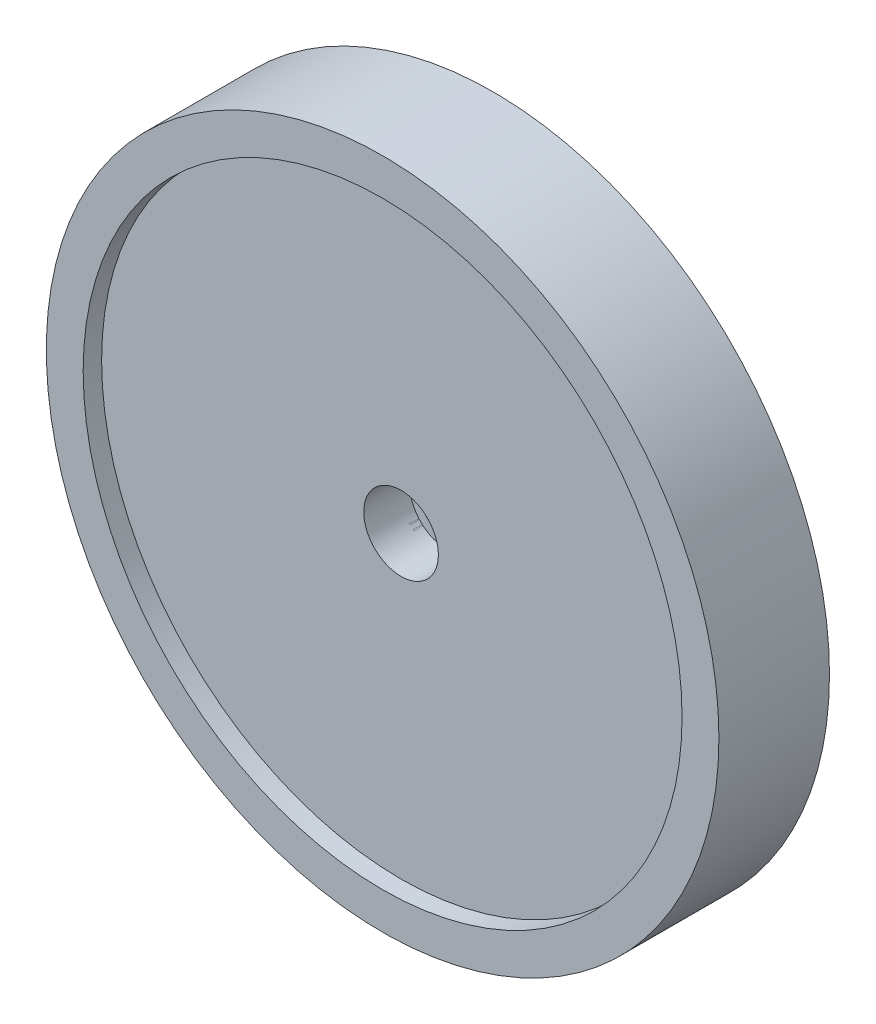
ISO-10303-21;
HEADER;
FILE_DESCRIPTION(('STEP AP214'),'2;1');
FILE_NAME('part.step','',(''),(''),'','','');
FILE_SCHEMA(('AUTOMOTIVE_DESIGN { 1 0 10303 214 1 1 1 1 }'));
ENDSEC;
DATA;
#1=APPLICATION_CONTEXT('core data for automotive mechanical design processes');
#2=APPLICATION_PROTOCOL_DEFINITION('international standard','automotive_design',2000,#1);
#3=PRODUCT_CONTEXT('',#1,'mechanical');
#4=PRODUCT('Part','Part','',(#3));
#5=PRODUCT_RELATED_PRODUCT_CATEGORY('part','',(#4));
#6=PRODUCT_DEFINITION_FORMATION('','',#4);
#7=PRODUCT_DEFINITION_CONTEXT('part definition',#1,'design');
#8=PRODUCT_DEFINITION('design','',#6,#7);
#9=PRODUCT_DEFINITION_SHAPE('','',#8);
#10=(LENGTH_UNIT() NAMED_UNIT(*) SI_UNIT(.MILLI.,.METRE.));
#11=(NAMED_UNIT(*) PLANE_ANGLE_UNIT() SI_UNIT($,.RADIAN.));
#12=(NAMED_UNIT(*) SI_UNIT($,.STERADIAN.) SOLID_ANGLE_UNIT());
#13=UNCERTAINTY_MEASURE_WITH_UNIT(LENGTH_MEASURE(1.E-05),#10,'distance_accuracy_value','');
#14=(GEOMETRIC_REPRESENTATION_CONTEXT(3) GLOBAL_UNCERTAINTY_ASSIGNED_CONTEXT((#13)) GLOBAL_UNIT_ASSIGNED_CONTEXT((#10,
#11,#12)) REPRESENTATION_CONTEXT('',''));
#15=CARTESIAN_POINT('',(0.,0.,0.));
#16=DIRECTION('',(0.,0.,1.));
#17=DIRECTION('',(1.,0.,0.));
#18=AXIS2_PLACEMENT_3D('',#15,#16,#17);
#19=CARTESIAN_POINT('',(0.,0.,-9.34562073675797));
#20=DIRECTION('',(0.,0.,-1.));
#21=DIRECTION('',(-1.,0.,0.));
#22=AXIS2_PLACEMENT_3D('',#19,#20,#21);
#23=PLANE('',#22);
#24=CARTESIAN_POINT('',(0.,0.,-9.34562073675797));
#25=DIRECTION('',(0.,0.,-1.));
#26=DIRECTION('',(-1.,0.,0.));
#27=AXIS2_PLACEMENT_3D('',#24,#25,#26);
#28=CIRCLE('',#27,4.05);
#29=CARTESIAN_POINT('',(-4.05,0.,-9.34562073675797));
#30=VERTEX_POINT('',#29);
#31=EDGE_CURVE('E11',#30,#30,#28,.T.);
#32=ORIENTED_EDGE('',*,*,#31,.T.);
#33=EDGE_LOOP('',(#32));
#34=FACE_BOUND('',#33,.T.);
#35=CARTESIAN_POINT('',(0.,0.,-9.34562073675797));
#36=DIRECTION('',(0.,0.,-1.));
#37=DIRECTION('',(-1.,0.,0.));
#38=AXIS2_PLACEMENT_3D('',#35,#36,#37);
#39=CIRCLE('',#38,3.05);
#40=CARTESIAN_POINT('',(-3.05,0.,-9.34562073675797));
#41=VERTEX_POINT('',#40);
#42=EDGE_CURVE('E55',#41,#41,#39,.T.);
#43=ORIENTED_EDGE('',*,*,#42,.F.);
#44=EDGE_LOOP('',(#43));
#45=FACE_BOUND('',#44,.T.);
#46=ADVANCED_FACE('F44',(#34,#45),#23,.T.);
#47=CARTESIAN_POINT('',(0.,0.,-1.));
#48=DIRECTION('',(0.,0.,-1.));
#49=DIRECTION('',(-1.,0.,0.));
#50=AXIS2_PLACEMENT_3D('',#47,#48,#49);
#51=PLANE('',#50);
#52=CARTESIAN_POINT('',(0.,0.,-1.));
#53=DIRECTION('',(0.,0.,-1.));
#54=DIRECTION('',(-1.,0.,0.));
#55=AXIS2_PLACEMENT_3D('',#52,#53,#54);
#56=CIRCLE('',#55,4.05);
#57=CARTESIAN_POINT('',(-4.05,0.,-1.));
#58=VERTEX_POINT('',#57);
#59=EDGE_CURVE('E48',#58,#58,#56,.T.);
#60=ORIENTED_EDGE('',*,*,#59,.F.);
#61=EDGE_LOOP('',(#60));
#62=FACE_BOUND('',#61,.T.);
#63=CARTESIAN_POINT('',(0.,0.,-1.));
#64=DIRECTION('',(0.,0.,-1.));
#65=DIRECTION('',(-1.,0.,0.));
#66=AXIS2_PLACEMENT_3D('',#63,#64,#65);
#67=CIRCLE('',#66,3.05);
#68=CARTESIAN_POINT('',(-3.05,0.,-1.));
#69=VERTEX_POINT('',#68);
#70=EDGE_CURVE('E57',#69,#69,#67,.T.);
#71=ORIENTED_EDGE('',*,*,#70,.T.);
#72=EDGE_LOOP('',(#71));
#73=FACE_BOUND('',#72,.T.);
#74=ADVANCED_FACE('F67',(#62,#73),#51,.F.);
#75=CARTESIAN_POINT('',(0.,0.,-9.34562073675797));
#76=DIRECTION('',(0.,0.,1.));
#77=DIRECTION('',(1.,0.,0.));
#78=AXIS2_PLACEMENT_3D('',#75,#76,#77);
#79=CYLINDRICAL_SURFACE('',#78,4.05);
#80=ORIENTED_EDGE('',*,*,#31,.F.);
#81=EDGE_LOOP('',(#80));
#82=FACE_BOUND('',#81,.T.);
#83=ORIENTED_EDGE('',*,*,#59,.T.);
#84=EDGE_LOOP('',(#83));
#85=FACE_BOUND('',#84,.T.);
#86=ADVANCED_FACE('F46',(#82,#85),#79,.T.);
#87=CARTESIAN_POINT('',(0.,0.,-9.34562073675797));
#88=DIRECTION('',(0.,0.,1.));
#89=DIRECTION('',(1.,0.,0.));
#90=AXIS2_PLACEMENT_3D('',#87,#88,#89);
#91=CYLINDRICAL_SURFACE('',#90,3.05);
#92=ORIENTED_EDGE('',*,*,#42,.T.);
#93=EDGE_LOOP('',(#92));
#94=FACE_BOUND('',#93,.T.);
#95=ORIENTED_EDGE('',*,*,#70,.F.);
#96=EDGE_LOOP('',(#95));
#97=FACE_BOUND('',#96,.T.);
#98=ADVANCED_FACE('F63',(#94,#97),#91,.F.);
#99=CLOSED_SHELL('',(#46,#74,#86,#98));
#100=MANIFOLD_SOLID_BREP('B2',#99);
#101=CARTESIAN_POINT('',(-11.329341995104,10.6222352139174,0.));
#102=DIRECTION('',(0.,0.,-1.));
#103=DIRECTION('',(-1.,0.,0.));
#104=AXIS2_PLACEMENT_3D('',#101,#102,#103);
#105=PLANE('',#104);
#106=CARTESIAN_POINT('',(0.,0.,0.));
#107=DIRECTION('',(0.,0.,-1.));
#108=DIRECTION('',(-1.,0.,0.));
#109=AXIS2_PLACEMENT_3D('',#106,#107,#108);
#110=CIRCLE('',#109,4.05);
#111=CARTESIAN_POINT('',(2.48832099086697,-3.19542777205351,0.));
#112=VERTEX_POINT('',#111);
#113=CARTESIAN_POINT('',(3.19542777205351,-2.48832099086696,0.));
#114=VERTEX_POINT('',#113);
#115=EDGE_CURVE('E120',#112,#114,#110,.F.);
#116=ORIENTED_EDGE('',*,*,#115,.F.);
#117=DIRECTION('',(-0.707106781186549,0.707106781186546,0.));
#118=VECTOR('',#117,1.);
#119=CARTESIAN_POINT('',(-11.329341995104,10.6222352139174,0.));
#120=LINE('',#119,#118);
#121=CARTESIAN_POINT('',(10.6222352139174,-11.3293419951039,0.));
#122=VERTEX_POINT('',#121);
#123=EDGE_CURVE('E157',#122,#112,#120,.T.);
#124=ORIENTED_EDGE('',*,*,#123,.F.);
#125=DIRECTION('',(0.707106781186546,0.707106781186549,0.));
#126=VECTOR('',#125,1.);
#127=CARTESIAN_POINT('',(10.6222352139174,-11.3293419951039,0.));
#128=LINE('',#127,#126);
#129=CARTESIAN_POINT('',(11.329341995104,-10.6222352139174,0.));
#130=VERTEX_POINT('',#129);
#131=EDGE_CURVE('E161',#122,#130,#128,.T.);
#132=ORIENTED_EDGE('',*,*,#131,.T.);
#133=DIRECTION('',(-0.707106781186549,0.707106781186546,0.));
#134=VECTOR('',#133,1.);
#135=CARTESIAN_POINT('',(-10.6222352139174,11.3293419951039,0.));
#136=LINE('',#135,#134);
#137=EDGE_CURVE('E155',#130,#114,#136,.T.);
#138=ORIENTED_EDGE('',*,*,#137,.T.);
#139=EDGE_LOOP('',(#116,#124,#132,#138));
#140=FACE_BOUND('',#139,.T.);
#141=ADVANCED_FACE('F116',(#140),#105,.F.);
#142=CARTESIAN_POINT('',(-0.353553390593273,-0.353553390593274,0.));
#143=DIRECTION('',(0.707106781186546,0.707106781186549,0.));
#144=DIRECTION('',(-0.707106781186549,0.707106781186546,0.));
#145=AXIS2_PLACEMENT_3D('',#142,#143,#144);
#146=PLANE('',#145);
#147=DIRECTION('',(0.,0.,1.));
#148=VECTOR('',#147,1.);
#149=CARTESIAN_POINT('',(2.48832099086697,-3.19542777205351,-74.));
#150=LINE('',#149,#148);
#151=CARTESIAN_POINT('',(2.48832099086697,-3.19542777205351,-9.34652087360312));
#152=VERTEX_POINT('',#151);
#153=EDGE_CURVE('E146',#152,#112,#150,.T.);
#154=ORIENTED_EDGE('',*,*,#153,.F.);
#155=DIRECTION('',(0.548789430225534,-0.548789430225533,0.630603141877258));
#156=VECTOR('',#155,1.);
#157=CARTESIAN_POINT('',(10.6222352139174,-11.3293419951039,0.));
#158=LINE('',#157,#156);
#159=EDGE_CURVE('E162',#152,#122,#158,.T.);
#160=ORIENTED_EDGE('',*,*,#159,.T.);
#161=ORIENTED_EDGE('',*,*,#123,.T.);
#162=EDGE_LOOP('',(#154,#160,#161));
#163=FACE_BOUND('',#162,.T.);
#164=ADVANCED_FACE('F172',(#163),#146,.F.);
#165=CARTESIAN_POINT('',(0.353553390593273,0.353553390593274,0.));
#166=DIRECTION('',(0.707106781186546,0.707106781186549,0.));
#167=DIRECTION('',(-0.707106781186549,0.707106781186546,0.));
#168=AXIS2_PLACEMENT_3D('',#165,#166,#167);
#169=PLANE('',#168);
#170=DIRECTION('',(0.548789430225534,-0.548789430225533,0.630603141877258));
#171=VECTOR('',#170,1.);
#172=CARTESIAN_POINT('',(11.329341995104,-10.6222352139174,0.));
#173=LINE('',#172,#171);
#174=CARTESIAN_POINT('',(3.19542777205351,-2.48832099086696,-9.34652087360313));
#175=VERTEX_POINT('',#174);
#176=EDGE_CURVE('E156',#175,#130,#173,.T.);
#177=ORIENTED_EDGE('',*,*,#176,.F.);
#178=DIRECTION('',(0.,0.,1.));
#179=VECTOR('',#178,1.);
#180=CARTESIAN_POINT('',(3.19542777205351,-2.48832099086696,-74.));
#181=LINE('',#180,#179);
#182=EDGE_CURVE('E145',#175,#114,#181,.T.);
#183=ORIENTED_EDGE('',*,*,#182,.T.);
#184=ORIENTED_EDGE('',*,*,#137,.F.);
#185=EDGE_LOOP('',(#177,#183,#184));
#186=FACE_BOUND('',#185,.T.);
#187=ADVANCED_FACE('F154',(#186),#169,.T.);
#188=CARTESIAN_POINT('',(10.6222352139174,-11.3293419951039,0.));
#189=DIRECTION('',(-0.445903757858952,0.445903757858951,0.776105455111953));
#190=DIRECTION('',(0.867078545472335,0.,0.498171452395238));
#191=AXIS2_PLACEMENT_3D('',#188,#189,#190);
#192=PLANE('',#191);
#193=CARTESIAN_POINT('',(0.,0.,-12.6120628375452));
#194=DIRECTION('',(-0.445903757858952,0.445903757858951,0.776105455111953));
#195=DIRECTION('',(0.548789430225534,-0.548789430225533,0.630603141877258));
#196=AXIS2_PLACEMENT_3D('',#193,#194,#195);
#197=ELLIPSE('',#196,5.2183630115263,4.05);
#198=EDGE_CURVE('E42',#175,#152,#197,.F.);
#199=ORIENTED_EDGE('',*,*,#198,.F.);
#200=ORIENTED_EDGE('',*,*,#176,.T.);
#201=ORIENTED_EDGE('',*,*,#131,.F.);
#202=ORIENTED_EDGE('',*,*,#159,.F.);
#203=EDGE_LOOP('',(#199,#200,#201,#202));
#204=FACE_BOUND('',#203,.T.);
#205=ADVANCED_FACE('F169',(#204),#192,.F.);
#206=CARTESIAN_POINT('',(0.,0.,-74.));
#207=DIRECTION('',(0.,0.,1.));
#208=DIRECTION('',(1.,0.,0.));
#209=AXIS2_PLACEMENT_3D('',#206,#207,#208);
#210=CYLINDRICAL_SURFACE('',#209,4.05);
#211=ORIENTED_EDGE('',*,*,#153,.T.);
#212=ORIENTED_EDGE('',*,*,#115,.T.);
#213=ORIENTED_EDGE('',*,*,#182,.F.);
#214=ORIENTED_EDGE('',*,*,#198,.T.);
#215=EDGE_LOOP('',(#211,#212,#213,#214));
#216=FACE_BOUND('',#215,.T.);
#217=ADVANCED_FACE('F118',(#216),#210,.F.);
#218=CLOSED_SHELL('',(#141,#164,#187,#205,#217));
#219=MANIFOLD_SOLID_BREP('B6',#218);
#220=CARTESIAN_POINT('',(10.526611910621,11.2337186918076,0.));
#221=DIRECTION('',(0.,0.,-1.));
#222=DIRECTION('',(-1.,0.,0.));
#223=AXIS2_PLACEMENT_3D('',#220,#221,#222);
#224=PLANE('',#223);
#225=CARTESIAN_POINT('',(0.,0.,0.));
#226=DIRECTION('',(0.,0.,-1.));
#227=DIRECTION('',(-1.,0.,0.));
#228=AXIS2_PLACEMENT_3D('',#225,#226,#227);
#229=CIRCLE('',#228,4.05);
#230=CARTESIAN_POINT('',(-3.19542777205351,-2.48832099086697,0.));
#231=VERTEX_POINT('',#230);
#232=CARTESIAN_POINT('',(-2.48832099086696,-3.19542777205351,0.));
#233=VERTEX_POINT('',#232);
#234=EDGE_CURVE('E228',#231,#233,#229,.F.);
#235=ORIENTED_EDGE('',*,*,#234,.F.);
#236=DIRECTION('',(0.707106781186546,0.707106781186549,0.));
#237=VECTOR('',#236,1.);
#238=CARTESIAN_POINT('',(10.526611910621,11.2337186918076,0.));
#239=LINE('',#238,#237);
#240=CARTESIAN_POINT('',(-11.4249652984003,-10.7178585172138,0.));
#241=VERTEX_POINT('',#240);
#242=EDGE_CURVE('E265',#241,#231,#239,.T.);
#243=ORIENTED_EDGE('',*,*,#242,.F.);
#244=DIRECTION('',(0.707106781186549,-0.707106781186546,0.));
#245=VECTOR('',#244,1.);
#246=CARTESIAN_POINT('',(-11.4249652984003,-10.7178585172138,0.));
#247=LINE('',#246,#245);
#248=CARTESIAN_POINT('',(-10.7178585172137,-11.4249652984003,0.));
#249=VERTEX_POINT('',#248);
#250=EDGE_CURVE('E269',#241,#249,#247,.T.);
#251=ORIENTED_EDGE('',*,*,#250,.T.);
#252=DIRECTION('',(0.707106781186546,0.707106781186549,0.));
#253=VECTOR('',#252,1.);
#254=CARTESIAN_POINT('',(11.2337186918076,10.5266119106211,0.));
#255=LINE('',#254,#253);
#256=EDGE_CURVE('E263',#249,#233,#255,.T.);
#257=ORIENTED_EDGE('',*,*,#256,.T.);
#258=EDGE_LOOP('',(#235,#243,#251,#257));
#259=FACE_BOUND('',#258,.T.);
#260=ADVANCED_FACE('F224',(#259),#224,.F.);
#261=CARTESIAN_POINT('',(-0.353553390593276,0.353553390593274,0.));
#262=DIRECTION('',(0.707106781186549,-0.707106781186546,0.));
#263=DIRECTION('',(0.707106781186546,0.707106781186549,0.));
#264=AXIS2_PLACEMENT_3D('',#261,#262,#263);
#265=PLANE('',#264);
#266=DIRECTION('',(0.,0.,1.));
#267=VECTOR('',#266,1.);
#268=CARTESIAN_POINT('',(-3.1954277720535,-2.48832099086698,-74.));
#269=LINE('',#268,#267);
#270=CARTESIAN_POINT('',(-3.19542777205351,-2.48832099086697,-9.45639973091015));
#271=VERTEX_POINT('',#270);
#272=EDGE_CURVE('E254',#271,#231,#269,.T.);
#273=ORIENTED_EDGE('',*,*,#272,.F.);
#274=DIRECTION('',(-0.548789430225533,-0.548789430225534,0.630603141877258));
#275=VECTOR('',#274,1.);
#276=CARTESIAN_POINT('',(-11.4249652984003,-10.7178585172138,0.));
#277=LINE('',#276,#275);
#278=EDGE_CURVE('E270',#271,#241,#277,.T.);
#279=ORIENTED_EDGE('',*,*,#278,.T.);
#280=ORIENTED_EDGE('',*,*,#242,.T.);
#281=EDGE_LOOP('',(#273,#279,#280));
#282=FACE_BOUND('',#281,.T.);
#283=ADVANCED_FACE('F280',(#282),#265,.F.);
#284=CARTESIAN_POINT('',(0.353553390593273,-0.353553390593272,0.));
#285=DIRECTION('',(0.707106781186549,-0.707106781186546,0.));
#286=DIRECTION('',(0.707106781186546,0.707106781186549,0.));
#287=AXIS2_PLACEMENT_3D('',#284,#285,#286);
#288=PLANE('',#287);
#289=DIRECTION('',(-0.548789430225533,-0.548789430225534,0.630603141877258));
#290=VECTOR('',#289,1.);
#291=CARTESIAN_POINT('',(-10.7178585172137,-11.4249652984003,0.));
#292=LINE('',#291,#290);
#293=CARTESIAN_POINT('',(-2.48832099086695,-3.19542777205352,-9.45639973091015));
#294=VERTEX_POINT('',#293);
#295=EDGE_CURVE('E264',#294,#249,#292,.T.);
#296=ORIENTED_EDGE('',*,*,#295,.F.);
#297=DIRECTION('',(0.,0.,1.));
#298=VECTOR('',#297,1.);
#299=CARTESIAN_POINT('',(-2.48832099086695,-3.19542777205352,-74.));
#300=LINE('',#299,#298);
#301=EDGE_CURVE('E253',#294,#233,#300,.T.);
#302=ORIENTED_EDGE('',*,*,#301,.T.);
#303=ORIENTED_EDGE('',*,*,#256,.F.);
#304=EDGE_LOOP('',(#296,#302,#303));
#305=FACE_BOUND('',#304,.T.);
#306=ADVANCED_FACE('F262',(#305),#288,.T.);
#307=CARTESIAN_POINT('',(-11.4249652984003,-10.7178585172138,0.));
#308=DIRECTION('',(0.445903757858951,0.445903757858952,0.776105455111953));
#309=DIRECTION('',(0.,-0.867078545472335,0.498171452395238));
#310=AXIS2_PLACEMENT_3D('',#307,#308,#309);
#311=PLANE('',#310);
#312=CARTESIAN_POINT('',(0.,0.,-12.7219416948522));
#313=DIRECTION('',(0.445903757858951,0.445903757858952,0.776105455111953));
#314=DIRECTION('',(-0.548789430225533,-0.548789430225535,0.630603141877258));
#315=AXIS2_PLACEMENT_3D('',#312,#313,#314);
#316=ELLIPSE('',#315,5.2183630115263,4.05);
#317=EDGE_CURVE('E114',#294,#271,#316,.F.);
#318=ORIENTED_EDGE('',*,*,#317,.F.);
#319=ORIENTED_EDGE('',*,*,#295,.T.);
#320=ORIENTED_EDGE('',*,*,#250,.F.);
#321=ORIENTED_EDGE('',*,*,#278,.F.);
#322=EDGE_LOOP('',(#318,#319,#320,#321));
#323=FACE_BOUND('',#322,.T.);
#324=ADVANCED_FACE('F277',(#323),#311,.F.);
#325=CARTESIAN_POINT('',(0.,0.,-74.));
#326=DIRECTION('',(0.,0.,1.));
#327=DIRECTION('',(1.,0.,0.));
#328=AXIS2_PLACEMENT_3D('',#325,#326,#327);
#329=CYLINDRICAL_SURFACE('',#328,4.05);
#330=ORIENTED_EDGE('',*,*,#272,.T.);
#331=ORIENTED_EDGE('',*,*,#234,.T.);
#332=ORIENTED_EDGE('',*,*,#301,.F.);
#333=ORIENTED_EDGE('',*,*,#317,.T.);
#334=EDGE_LOOP('',(#330,#331,#332,#333));
#335=FACE_BOUND('',#334,.T.);
#336=ADVANCED_FACE('F226',(#335),#329,.F.);
#337=CLOSED_SHELL('',(#260,#283,#306,#324,#336));
#338=MANIFOLD_SOLID_BREP('B36',#337);
#339=CARTESIAN_POINT('',(0.353553390593273,0.353553390593274,0.));
#340=DIRECTION('',(0.707106781186546,0.707106781186549,0.));
#341=DIRECTION('',(-0.707106781186549,0.707106781186546,0.));
#342=AXIS2_PLACEMENT_3D('',#339,#340,#341);
#343=PLANE('',#342);
#344=DIRECTION('',(-0.707106781186549,0.707106781186546,0.));
#345=VECTOR('',#344,1.);
#346=CARTESIAN_POINT('',(-10.6222352139174,11.3293419951039,0.));
#347=LINE('',#346,#345);
#348=CARTESIAN_POINT('',(-2.48832099086697,3.19542777205351,0.));
#349=VERTEX_POINT('',#348);
#350=CARTESIAN_POINT('',(-10.6222352139174,11.3293419951039,0.));
#351=VERTEX_POINT('',#350);
#352=EDGE_CURVE('E374',#349,#351,#347,.T.);
#353=ORIENTED_EDGE('',*,*,#352,.F.);
#354=DIRECTION('',(0.,0.,1.));
#355=VECTOR('',#354,1.);
#356=CARTESIAN_POINT('',(-2.48832099086697,3.19542777205351,-74.));
#357=LINE('',#356,#355);
#358=CARTESIAN_POINT('',(-2.48832099086697,3.19542777205351,-9.34652087360313));
#359=VERTEX_POINT('',#358);
#360=EDGE_CURVE('E222',#349,#359,#357,.F.);
#361=ORIENTED_EDGE('',*,*,#360,.T.);
#362=DIRECTION('',(0.548789430225534,-0.548789430225533,-0.630603141877258));
#363=VECTOR('',#362,1.);
#364=CARTESIAN_POINT('',(0.353553390593273,0.353553390593275,-12.6120628375452));
#365=LINE('',#364,#363);
#366=EDGE_CURVE('E377',#351,#359,#365,.T.);
#367=ORIENTED_EDGE('',*,*,#366,.F.);
#368=EDGE_LOOP('',(#353,#361,#367));
#369=FACE_BOUND('',#368,.T.);
#370=ADVANCED_FACE('F332',(#369),#343,.T.);
#371=CARTESIAN_POINT('',(-0.353553390593273,-0.353553390593274,0.));
#372=DIRECTION('',(0.707106781186546,0.707106781186549,0.));
#373=DIRECTION('',(-0.707106781186549,0.707106781186546,0.));
#374=AXIS2_PLACEMENT_3D('',#371,#372,#373);
#375=PLANE('',#374);
#376=DIRECTION('',(0.,0.,1.));
#377=VECTOR('',#376,1.);
#378=CARTESIAN_POINT('',(-3.19542777205351,2.48832099086696,-74.));
#379=LINE('',#378,#377);
#380=CARTESIAN_POINT('',(-3.19542777205351,2.48832099086696,0.));
#381=VERTEX_POINT('',#380);
#382=CARTESIAN_POINT('',(-3.19542777205351,2.48832099086696,-9.34652087360313));
#383=VERTEX_POINT('',#382);
#384=EDGE_CURVE('E375',#381,#383,#379,.F.);
#385=ORIENTED_EDGE('',*,*,#384,.F.);
#386=DIRECTION('',(-0.707106781186549,0.707106781186546,0.));
#387=VECTOR('',#386,1.);
#388=CARTESIAN_POINT('',(-11.329341995104,10.6222352139174,0.));
#389=LINE('',#388,#387);
#390=CARTESIAN_POINT('',(-11.329341995104,10.6222352139174,0.));
#391=VERTEX_POINT('',#390);
#392=EDGE_CURVE('E355',#381,#391,#389,.T.);
#393=ORIENTED_EDGE('',*,*,#392,.T.);
#394=DIRECTION('',(0.548789430225534,-0.548789430225533,-0.630603141877258));
#395=VECTOR('',#394,1.);
#396=CARTESIAN_POINT('',(-0.353553390593274,-0.353553390593274,-12.6120628375452));
#397=LINE('',#396,#395);
#398=EDGE_CURVE('E383',#391,#383,#397,.T.);
#399=ORIENTED_EDGE('',*,*,#398,.T.);
#400=EDGE_LOOP('',(#385,#393,#399));
#401=FACE_BOUND('',#400,.T.);
#402=ADVANCED_FACE('F387',(#401),#375,.F.);
#403=CARTESIAN_POINT('',(-0.353553390593274,-0.353553390593274,-12.6120628375452));
#404=DIRECTION('',(0.445903757858952,-0.445903757858951,0.776105455111953));
#405=DIRECTION('',(0.867078545472335,0.,-0.498171452395238));
#406=AXIS2_PLACEMENT_3D('',#403,#404,#405);
#407=PLANE('',#406);
#408=CARTESIAN_POINT('',(0.,0.,-12.6120628375452));
#409=DIRECTION('',(0.445903757858952,-0.445903757858951,0.776105455111953));
#410=DIRECTION('',(-0.548789430225534,0.548789430225533,0.630603141877258));
#411=AXIS2_PLACEMENT_3D('',#408,#409,#410);
#412=ELLIPSE('',#411,5.2183630115263,4.05);
#413=EDGE_CURVE('E347',#383,#359,#412,.F.);
#414=ORIENTED_EDGE('',*,*,#413,.F.);
#415=ORIENTED_EDGE('',*,*,#398,.F.);
#416=DIRECTION('',(0.707106781186546,0.707106781186549,0.));
#417=VECTOR('',#416,1.);
#418=CARTESIAN_POINT('',(-11.329341995104,10.6222352139174,0.));
#419=LINE('',#418,#417);
#420=EDGE_CURVE('E340',#391,#351,#419,.T.);
#421=ORIENTED_EDGE('',*,*,#420,.T.);
#422=ORIENTED_EDGE('',*,*,#366,.T.);
#423=EDGE_LOOP('',(#414,#415,#421,#422));
#424=FACE_BOUND('',#423,.T.);
#425=ADVANCED_FACE('F388',(#424),#407,.F.);
#426=CARTESIAN_POINT('',(-11.329341995104,10.6222352139174,0.));
#427=DIRECTION('',(0.,0.,-1.));
#428=DIRECTION('',(-1.,0.,0.));
#429=AXIS2_PLACEMENT_3D('',#426,#427,#428);
#430=PLANE('',#429);
#431=CARTESIAN_POINT('',(0.,0.,0.));
#432=DIRECTION('',(0.,0.,-1.));
#433=DIRECTION('',(-1.,0.,0.));
#434=AXIS2_PLACEMENT_3D('',#431,#432,#433);
#435=CIRCLE('',#434,4.05);
#436=EDGE_CURVE('E367',#349,#381,#435,.F.);
#437=ORIENTED_EDGE('',*,*,#436,.F.);
#438=ORIENTED_EDGE('',*,*,#352,.T.);
#439=ORIENTED_EDGE('',*,*,#420,.F.);
#440=ORIENTED_EDGE('',*,*,#392,.F.);
#441=EDGE_LOOP('',(#437,#438,#439,#440));
#442=FACE_BOUND('',#441,.T.);
#443=ADVANCED_FACE('F334',(#442),#430,.F.);
#444=CARTESIAN_POINT('',(0.,0.,-74.));
#445=DIRECTION('',(0.,0.,1.));
#446=DIRECTION('',(1.,0.,0.));
#447=AXIS2_PLACEMENT_3D('',#444,#445,#446);
#448=CYLINDRICAL_SURFACE('',#447,4.05);
#449=ORIENTED_EDGE('',*,*,#384,.T.);
#450=ORIENTED_EDGE('',*,*,#413,.T.);
#451=ORIENTED_EDGE('',*,*,#360,.F.);
#452=ORIENTED_EDGE('',*,*,#436,.T.);
#453=EDGE_LOOP('',(#449,#450,#451,#452));
#454=FACE_BOUND('',#453,.T.);
#455=ADVANCED_FACE('F366',(#454),#448,.F.);
#456=CLOSED_SHELL('',(#370,#402,#425,#443,#455));
#457=MANIFOLD_SOLID_BREP('B108',#456);
#458=CARTESIAN_POINT('',(0.353553390593273,-0.353553390593272,0.));
#459=DIRECTION('',(0.707106781186549,-0.707106781186546,0.));
#460=DIRECTION('',(0.707106781186546,0.707106781186549,0.));
#461=AXIS2_PLACEMENT_3D('',#458,#459,#460);
#462=PLANE('',#461);
#463=DIRECTION('',(0.707106781186546,0.707106781186549,0.));
#464=VECTOR('',#463,1.);
#465=CARTESIAN_POINT('',(11.2337186918076,10.5266119106211,0.));
#466=LINE('',#465,#464);
#467=CARTESIAN_POINT('',(3.19542777205351,2.48832099086696,0.));
#468=VERTEX_POINT('',#467);
#469=CARTESIAN_POINT('',(11.2337186918076,10.5266119106211,0.));
#470=VERTEX_POINT('',#469);
#471=EDGE_CURVE('E481',#468,#470,#466,.T.);
#472=ORIENTED_EDGE('',*,*,#471,.F.);
#473=DIRECTION('',(0.,0.,1.));
#474=VECTOR('',#473,1.);
#475=CARTESIAN_POINT('',(3.19542777205351,2.48832099086696,-74.));
#476=LINE('',#475,#474);
#477=CARTESIAN_POINT('',(3.19542777205351,2.48832099086696,-9.23664201629611));
#478=VERTEX_POINT('',#477);
#479=EDGE_CURVE('E330',#468,#478,#476,.F.);
#480=ORIENTED_EDGE('',*,*,#479,.T.);
#481=DIRECTION('',(-0.548789430225533,-0.548789430225535,-0.630603141877258));
#482=VECTOR('',#481,1.);
#483=CARTESIAN_POINT('',(0.257930087296933,-0.449176693889615,-12.6120628375452));
#484=LINE('',#483,#482);
#485=EDGE_CURVE('E484',#470,#478,#484,.T.);
#486=ORIENTED_EDGE('',*,*,#485,.F.);
#487=EDGE_LOOP('',(#472,#480,#486));
#488=FACE_BOUND('',#487,.T.);
#489=ADVANCED_FACE('F439',(#488),#462,.T.);
#490=CARTESIAN_POINT('',(-0.353553390593276,0.353553390593274,0.));
#491=DIRECTION('',(0.707106781186549,-0.707106781186546,0.));
#492=DIRECTION('',(0.707106781186546,0.707106781186549,0.));
#493=AXIS2_PLACEMENT_3D('',#490,#491,#492);
#494=PLANE('',#493);
#495=DIRECTION('',(0.,0.,1.));
#496=VECTOR('',#495,1.);
#497=CARTESIAN_POINT('',(2.48832099086697,3.19542777205351,-74.));
#498=LINE('',#497,#496);
#499=CARTESIAN_POINT('',(2.48832099086696,3.19542777205351,0.));
#500=VERTEX_POINT('',#499);
#501=CARTESIAN_POINT('',(2.48832099086696,3.19542777205352,-9.2366420162961));
#502=VERTEX_POINT('',#501);
#503=EDGE_CURVE('E482',#500,#502,#498,.F.);
#504=ORIENTED_EDGE('',*,*,#503,.F.);
#505=DIRECTION('',(0.707106781186546,0.707106781186549,0.));
#506=VECTOR('',#505,1.);
#507=CARTESIAN_POINT('',(10.526611910621,11.2337186918076,0.));
#508=LINE('',#507,#506);
#509=CARTESIAN_POINT('',(10.526611910621,11.2337186918076,0.));
#510=VERTEX_POINT('',#509);
#511=EDGE_CURVE('E462',#500,#510,#508,.T.);
#512=ORIENTED_EDGE('',*,*,#511,.T.);
#513=DIRECTION('',(-0.548789430225533,-0.548789430225535,-0.630603141877258));
#514=VECTOR('',#513,1.);
#515=CARTESIAN_POINT('',(-0.449176693889616,0.257930087296931,-12.6120628375452));
#516=LINE('',#515,#514);
#517=EDGE_CURVE('E490',#510,#502,#516,.T.);
#518=ORIENTED_EDGE('',*,*,#517,.T.);
#519=EDGE_LOOP('',(#504,#512,#518));
#520=FACE_BOUND('',#519,.T.);
#521=ADVANCED_FACE('F494',(#520),#494,.F.);
#522=CARTESIAN_POINT('',(-0.449176693889616,0.257930087296931,-12.6120628375452));
#523=DIRECTION('',(-0.445903757858951,-0.445903757858952,0.776105455111953));
#524=DIRECTION('',(0.,-0.867078545472335,-0.498171452395238));
#525=AXIS2_PLACEMENT_3D('',#522,#523,#524);
#526=PLANE('',#525);
#527=CARTESIAN_POINT('',(0.,0.,-12.5021839802381));
#528=DIRECTION('',(-0.445903757858951,-0.445903757858952,0.776105455111953));
#529=DIRECTION('',(0.548789430225533,0.548789430225535,0.630603141877258));
#530=AXIS2_PLACEMENT_3D('',#527,#528,#529);
#531=ELLIPSE('',#530,5.2183630115263,4.05);
#532=EDGE_CURVE('E454',#502,#478,#531,.F.);
#533=ORIENTED_EDGE('',*,*,#532,.F.);
#534=ORIENTED_EDGE('',*,*,#517,.F.);
#535=DIRECTION('',(0.707106781186549,-0.707106781186546,0.));
#536=VECTOR('',#535,1.);
#537=CARTESIAN_POINT('',(10.526611910621,11.2337186918076,0.));
#538=LINE('',#537,#536);
#539=EDGE_CURVE('E447',#510,#470,#538,.T.);
#540=ORIENTED_EDGE('',*,*,#539,.T.);
#541=ORIENTED_EDGE('',*,*,#485,.T.);
#542=EDGE_LOOP('',(#533,#534,#540,#541));
#543=FACE_BOUND('',#542,.T.);
#544=ADVANCED_FACE('F495',(#543),#526,.F.);
#545=CARTESIAN_POINT('',(10.526611910621,11.2337186918076,0.));
#546=DIRECTION('',(0.,0.,-1.));
#547=DIRECTION('',(-1.,0.,0.));
#548=AXIS2_PLACEMENT_3D('',#545,#546,#547);
#549=PLANE('',#548);
#550=CARTESIAN_POINT('',(0.,0.,0.));
#551=DIRECTION('',(0.,0.,-1.));
#552=DIRECTION('',(-1.,0.,0.));
#553=AXIS2_PLACEMENT_3D('',#550,#551,#552);
#554=CIRCLE('',#553,4.05);
#555=EDGE_CURVE('E474',#468,#500,#554,.F.);
#556=ORIENTED_EDGE('',*,*,#555,.F.);
#557=ORIENTED_EDGE('',*,*,#471,.T.);
#558=ORIENTED_EDGE('',*,*,#539,.F.);
#559=ORIENTED_EDGE('',*,*,#511,.F.);
#560=EDGE_LOOP('',(#556,#557,#558,#559));
#561=FACE_BOUND('',#560,.T.);
#562=ADVANCED_FACE('F441',(#561),#549,.F.);
#563=CARTESIAN_POINT('',(0.,0.,-74.));
#564=DIRECTION('',(0.,0.,1.));
#565=DIRECTION('',(1.,0.,0.));
#566=AXIS2_PLACEMENT_3D('',#563,#564,#565);
#567=CYLINDRICAL_SURFACE('',#566,4.05);
#568=ORIENTED_EDGE('',*,*,#503,.T.);
#569=ORIENTED_EDGE('',*,*,#532,.T.);
#570=ORIENTED_EDGE('',*,*,#479,.F.);
#571=ORIENTED_EDGE('',*,*,#555,.T.);
#572=EDGE_LOOP('',(#568,#569,#570,#571));
#573=FACE_BOUND('',#572,.T.);
#574=ADVANCED_FACE('F473',(#573),#567,.F.);
#575=CLOSED_SHELL('',(#489,#521,#544,#562,#574));
#576=MANIFOLD_SOLID_BREP('B216',#575);
#577=CARTESIAN_POINT('',(0.5,0.,0.));
#578=DIRECTION('',(-1.,0.,0.));
#579=DIRECTION('',(0.,0.,1.));
#580=AXIS2_PLACEMENT_3D('',#577,#578,#579);
#581=PLANE('',#580);
#582=DIRECTION('',(0.,0.,1.));
#583=VECTOR('',#582,1.);
#584=CARTESIAN_POINT('',(0.5,-4.01901729282172,-74.));
#585=LINE('',#584,#583);
#586=CARTESIAN_POINT('',(0.5,-4.01901729282172,-1.));
#587=VERTEX_POINT('',#586);
#588=CARTESIAN_POINT('',(0.5,-4.01901729282172,-9.37093764576652));
#589=VERTEX_POINT('',#588);
#590=EDGE_CURVE('E751',#587,#589,#585,.F.);
#591=ORIENTED_EDGE('',*,*,#590,.F.);
#592=DIRECTION('',(0.,1.,0.));
#593=VECTOR('',#592,1.);
#594=CARTESIAN_POINT('',(0.5,0.,-1.));
#595=LINE('',#594,#593);
#596=CARTESIAN_POINT('',(0.5,-14.2633291003554,-1.));
#597=VERTEX_POINT('',#596);
#598=EDGE_CURVE('E545',#597,#587,#595,.T.);
#599=ORIENTED_EDGE('',*,*,#598,.F.);
#600=DIRECTION('',(0.,0.774356206041149,-0.632749923876375));
#601=VECTOR('',#600,1.);
#602=CARTESIAN_POINT('',(0.5,0.,-12.6549984775275));
#603=LINE('',#602,#601);
#604=EDGE_CURVE('E668',#597,#589,#603,.T.);
#605=ORIENTED_EDGE('',*,*,#604,.T.);
#606=EDGE_LOOP('',(#591,#599,#605));
#607=FACE_BOUND('',#606,.T.);
#608=ADVANCED_FACE('F537',(#607),#581,.F.);
#609=CARTESIAN_POINT('',(-0.5,0.,0.));
#610=DIRECTION('',(-1.,0.,0.));
#611=DIRECTION('',(0.,0.,1.));
#612=AXIS2_PLACEMENT_3D('',#609,#610,#611);
#613=PLANE('',#612);
#614=DIRECTION('',(0.,1.,0.));
#615=VECTOR('',#614,1.);
#616=CARTESIAN_POINT('',(-0.5,0.,-1.));
#617=LINE('',#616,#615);
#618=CARTESIAN_POINT('',(-0.5,-14.2633291003554,-1.));
#619=VERTEX_POINT('',#618);
#620=CARTESIAN_POINT('',(-0.5,-4.01901729282172,-1.));
#621=VERTEX_POINT('',#620);
#622=EDGE_CURVE('E694',#619,#621,#617,.T.);
#623=ORIENTED_EDGE('',*,*,#622,.T.);
#624=DIRECTION('',(0.,0.,1.));
#625=VECTOR('',#624,1.);
#626=CARTESIAN_POINT('',(-0.5,-4.01901729282172,-74.));
#627=LINE('',#626,#625);
#628=CARTESIAN_POINT('',(-0.5,-4.01901729282172,-9.37093764576651));
#629=VERTEX_POINT('',#628);
#630=EDGE_CURVE('E760',#621,#629,#627,.F.);
#631=ORIENTED_EDGE('',*,*,#630,.T.);
#632=DIRECTION('',(0.,0.774356206041149,-0.632749923876375));
#633=VECTOR('',#632,1.);
#634=CARTESIAN_POINT('',(-0.5,0.,-12.6549984775275));
#635=LINE('',#634,#633);
#636=EDGE_CURVE('E669',#619,#629,#635,.T.);
#637=ORIENTED_EDGE('',*,*,#636,.F.);
#638=EDGE_LOOP('',(#623,#631,#637));
#639=FACE_BOUND('',#638,.T.);
#640=ADVANCED_FACE('F764',(#639),#613,.T.);
#641=DIRECTION('',(0.,0.,1.));
#642=VECTOR('',#641,1.);
#643=CARTESIAN_POINT('',(0.5,4.01901729282172,-74.));
#644=LINE('',#643,#642);
#645=CARTESIAN_POINT('',(0.5,4.01901729282172,-9.37093764576652));
#646=VERTEX_POINT('',#645);
#647=CARTESIAN_POINT('',(0.5,4.01901729282172,-1.));
#648=VERTEX_POINT('',#647);
#649=EDGE_CURVE('E757',#646,#648,#644,.T.);
#650=ORIENTED_EDGE('',*,*,#649,.F.);
#651=DIRECTION('',(0.,0.774356206041149,0.632749923876375));
#652=VECTOR('',#651,1.);
#653=CARTESIAN_POINT('',(0.5,15.487124120823,0.));
#654=LINE('',#653,#652);
#655=CARTESIAN_POINT('',(0.5,14.2633291003554,-1.));
#656=VERTEX_POINT('',#655);
#657=EDGE_CURVE('E559',#646,#656,#654,.T.);
#658=ORIENTED_EDGE('',*,*,#657,.T.);
#659=EDGE_CURVE('E701',#648,#656,#595,.T.);
#660=ORIENTED_EDGE('',*,*,#659,.F.);
#661=EDGE_LOOP('',(#650,#658,#660));
#662=FACE_BOUND('',#661,.T.);
#663=ADVANCED_FACE('F773',(#662),#581,.F.);
#664=DIRECTION('',(0.,0.774356206041149,0.632749923876375));
#665=VECTOR('',#664,1.);
#666=CARTESIAN_POINT('',(-0.5,15.487124120823,0.));
#667=LINE('',#666,#665);
#668=CARTESIAN_POINT('',(-0.5,4.01901729282172,-9.37093764576651));
#669=VERTEX_POINT('',#668);
#670=CARTESIAN_POINT('',(-0.5,14.2633291003554,-1.));
#671=VERTEX_POINT('',#670);
#672=EDGE_CURVE('E666',#669,#671,#667,.T.);
#673=ORIENTED_EDGE('',*,*,#672,.F.);
#674=DIRECTION('',(0.,0.,1.));
#675=VECTOR('',#674,1.);
#676=CARTESIAN_POINT('',(-0.5,4.01901729282172,-74.));
#677=LINE('',#676,#675);
#678=CARTESIAN_POINT('',(-0.5,4.01901729282172,-1.));
#679=VERTEX_POINT('',#678);
#680=EDGE_CURVE('E721',#669,#679,#677,.T.);
#681=ORIENTED_EDGE('',*,*,#680,.T.);
#682=EDGE_CURVE('E691',#679,#671,#617,.T.);
#683=ORIENTED_EDGE('',*,*,#682,.T.);
#684=EDGE_LOOP('',(#673,#681,#683));
#685=FACE_BOUND('',#684,.T.);
#686=ADVANCED_FACE('F720',(#685),#613,.T.);
#687=CARTESIAN_POINT('',(0.,-0.5,0.));
#688=DIRECTION('',(0.,1.,0.));
#689=DIRECTION('',(0.,0.,1.));
#690=AXIS2_PLACEMENT_3D('',#687,#688,#689);
#691=PLANE('',#690);
#692=DIRECTION('',(0.,0.,1.));
#693=VECTOR('',#692,1.);
#694=CARTESIAN_POINT('',(-4.01901729282172,-0.5,-74.));
#695=LINE('',#694,#693);
#696=CARTESIAN_POINT('',(-4.01901729282172,-0.5,-1.));
#697=VERTEX_POINT('',#696);
#698=CARTESIAN_POINT('',(-4.01901729282172,-0.5,-9.37093764576652));
#699=VERTEX_POINT('',#698);
#700=EDGE_CURVE('E743',#697,#699,#695,.F.);
#701=ORIENTED_EDGE('',*,*,#700,.F.);
#702=DIRECTION('',(1.,0.,0.));
#703=VECTOR('',#702,1.);
#704=CARTESIAN_POINT('',(0.,-0.5,-1.));
#705=LINE('',#704,#703);
#706=CARTESIAN_POINT('',(-14.2633291003554,-0.5,-1.));
#707=VERTEX_POINT('',#706);
#708=EDGE_CURVE('E655',#707,#697,#705,.T.);
#709=ORIENTED_EDGE('',*,*,#708,.F.);
#710=DIRECTION('',(-0.774356206041149,0.,0.632749923876375));
#711=VECTOR('',#710,1.);
#712=CARTESIAN_POINT('',(0.,-0.5,-12.6549984775275));
#713=LINE('',#712,#711);
#714=EDGE_CURVE('E643',#699,#707,#713,.T.);
#715=ORIENTED_EDGE('',*,*,#714,.F.);
#716=EDGE_LOOP('',(#701,#709,#715));
#717=FACE_BOUND('',#716,.T.);
#718=ADVANCED_FACE('F742',(#717),#691,.F.);
#719=CARTESIAN_POINT('',(0.,0.5,0.));
#720=DIRECTION('',(0.,1.,0.));
#721=DIRECTION('',(0.,0.,1.));
#722=AXIS2_PLACEMENT_3D('',#719,#720,#721);
#723=PLANE('',#722);
#724=DIRECTION('',(1.,0.,0.));
#725=VECTOR('',#724,1.);
#726=CARTESIAN_POINT('',(0.,0.5,-1.));
#727=LINE('',#726,#725);
#728=CARTESIAN_POINT('',(-14.2633291003554,0.5,-1.));
#729=VERTEX_POINT('',#728);
#730=CARTESIAN_POINT('',(-4.01901729282172,0.5,-1.));
#731=VERTEX_POINT('',#730);
#732=EDGE_CURVE('E658',#729,#731,#727,.T.);
#733=ORIENTED_EDGE('',*,*,#732,.T.);
#734=DIRECTION('',(0.,0.,1.));
#735=VECTOR('',#734,1.);
#736=CARTESIAN_POINT('',(-4.01901729282172,0.5,-74.));
#737=LINE('',#736,#735);
#738=CARTESIAN_POINT('',(-4.01901729282172,0.5,-9.37093764576652));
#739=VERTEX_POINT('',#738);
#740=EDGE_CURVE('E731',#731,#739,#737,.F.);
#741=ORIENTED_EDGE('',*,*,#740,.T.);
#742=DIRECTION('',(-0.774356206041149,0.,0.632749923876375));
#743=VECTOR('',#742,1.);
#744=CARTESIAN_POINT('',(0.,0.5,-12.6549984775275));
#745=LINE('',#744,#743);
#746=EDGE_CURVE('E652',#739,#729,#745,.T.);
#747=ORIENTED_EDGE('',*,*,#746,.T.);
#748=EDGE_LOOP('',(#733,#741,#747));
#749=FACE_BOUND('',#748,.T.);
#750=ADVANCED_FACE('F730',(#749),#723,.T.);
#751=DIRECTION('',(-0.774356206041149,0.,-0.632749923876375));
#752=VECTOR('',#751,1.);
#753=CARTESIAN_POINT('',(15.487124120823,0.5,0.));
#754=LINE('',#753,#752);
#755=CARTESIAN_POINT('',(14.2633291003554,0.5,-1.));
#756=VERTEX_POINT('',#755);
#757=CARTESIAN_POINT('',(4.01901729282172,0.5,-9.37093764576651));
#758=VERTEX_POINT('',#757);
#759=EDGE_CURVE('E646',#756,#758,#754,.T.);
#760=ORIENTED_EDGE('',*,*,#759,.T.);
#761=DIRECTION('',(0.,0.,1.));
#762=VECTOR('',#761,1.);
#763=CARTESIAN_POINT('',(4.01901729282172,0.5,-74.));
#764=LINE('',#763,#762);
#765=CARTESIAN_POINT('',(4.01901729282172,0.5,-1.));
#766=VERTEX_POINT('',#765);
#767=EDGE_CURVE('E551',#758,#766,#764,.T.);
#768=ORIENTED_EDGE('',*,*,#767,.T.);
#769=EDGE_CURVE('E661',#766,#756,#727,.T.);
#770=ORIENTED_EDGE('',*,*,#769,.T.);
#771=EDGE_LOOP('',(#760,#768,#770));
#772=FACE_BOUND('',#771,.T.);
#773=ADVANCED_FACE('F749',(#772),#723,.T.);
#774=DIRECTION('',(0.,0.,1.));
#775=VECTOR('',#774,1.);
#776=CARTESIAN_POINT('',(4.01901729282172,-0.5,-74.));
#777=LINE('',#776,#775);
#778=CARTESIAN_POINT('',(4.01901729282172,-0.5,-9.37093764576651));
#779=VERTEX_POINT('',#778);
#780=CARTESIAN_POINT('',(4.01901729282172,-0.5,-1.));
#781=VERTEX_POINT('',#780);
#782=EDGE_CURVE('E626',#779,#781,#777,.T.);
#783=ORIENTED_EDGE('',*,*,#782,.F.);
#784=DIRECTION('',(-0.774356206041149,0.,-0.632749923876375));
#785=VECTOR('',#784,1.);
#786=CARTESIAN_POINT('',(15.487124120823,-0.5,0.));
#787=LINE('',#786,#785);
#788=CARTESIAN_POINT('',(14.2633291003554,-0.5,-1.));
#789=VERTEX_POINT('',#788);
#790=EDGE_CURVE('E636',#789,#779,#787,.T.);
#791=ORIENTED_EDGE('',*,*,#790,.F.);
#792=EDGE_CURVE('E637',#781,#789,#705,.T.);
#793=ORIENTED_EDGE('',*,*,#792,.F.);
#794=EDGE_LOOP('',(#783,#791,#793));
#795=FACE_BOUND('',#794,.T.);
#796=ADVANCED_FACE('F635',(#795),#691,.F.);
#797=CARTESIAN_POINT('',(0.5,0.,-12.6549984775275));
#798=DIRECTION('',(0.,0.632749923876375,0.774356206041149));
#799=DIRECTION('',(0.,-0.774356206041149,0.632749923876375));
#800=AXIS2_PLACEMENT_3D('',#797,#798,#799);
#801=PLANE('',#800);
#802=CARTESIAN_POINT('',(0.,0.,-12.6549984775275));
#803=DIRECTION('',(0.,0.632749923876375,0.774356206041149));
#804=DIRECTION('',(0.,-0.774356206041149,0.632749923876375));
#805=AXIS2_PLACEMENT_3D('',#802,#803,#804);
#806=ELLIPSE('',#805,5.23015114801674,4.05);
#807=EDGE_CURVE('E752',#589,#629,#806,.F.);
#808=ORIENTED_EDGE('',*,*,#807,.F.);
#809=ORIENTED_EDGE('',*,*,#604,.F.);
#810=DIRECTION('',(1.,0.,0.));
#811=VECTOR('',#810,1.);
#812=CARTESIAN_POINT('',(0.,-14.2633291003554,-1.));
#813=LINE('',#812,#811);
#814=EDGE_CURVE('E697',#619,#597,#813,.T.);
#815=ORIENTED_EDGE('',*,*,#814,.F.);
#816=ORIENTED_EDGE('',*,*,#636,.T.);
#817=EDGE_LOOP('',(#808,#809,#815,#816));
#818=FACE_BOUND('',#817,.T.);
#819=ADVANCED_FACE('F768',(#818),#801,.F.);
#820=CARTESIAN_POINT('',(0.,0.,-1.));
#821=DIRECTION('',(0.,0.,-1.));
#822=DIRECTION('',(-1.,0.,0.));
#823=AXIS2_PLACEMENT_3D('',#820,#821,#822);
#824=PLANE('',#823);
#825=ORIENTED_EDGE('',*,*,#708,.T.);
#826=CARTESIAN_POINT('',(0.,0.,-1.));
#827=DIRECTION('',(0.,0.,-1.));
#828=DIRECTION('',(-1.,0.,0.));
#829=AXIS2_PLACEMENT_3D('',#826,#827,#828);
#830=CIRCLE('',#829,4.05);
#831=EDGE_CURVE('E725',#697,#621,#830,.F.);
#832=ORIENTED_EDGE('',*,*,#831,.T.);
#833=ORIENTED_EDGE('',*,*,#622,.F.);
#834=ORIENTED_EDGE('',*,*,#814,.T.);
#835=ORIENTED_EDGE('',*,*,#598,.T.);
#836=EDGE_CURVE('E727',#587,#781,#830,.F.);
#837=ORIENTED_EDGE('',*,*,#836,.T.);
#838=ORIENTED_EDGE('',*,*,#792,.T.);
#839=DIRECTION('',(0.,1.,0.));
#840=VECTOR('',#839,1.);
#841=CARTESIAN_POINT('',(14.2633291003554,0.,-1.));
#842=LINE('',#841,#840);
#843=EDGE_CURVE('E642',#789,#756,#842,.T.);
#844=ORIENTED_EDGE('',*,*,#843,.T.);
#845=ORIENTED_EDGE('',*,*,#769,.F.);
#846=EDGE_CURVE('E711',#766,#648,#830,.F.);
#847=ORIENTED_EDGE('',*,*,#846,.T.);
#848=ORIENTED_EDGE('',*,*,#659,.T.);
#849=DIRECTION('',(-1.,0.,0.));
#850=VECTOR('',#849,1.);
#851=CARTESIAN_POINT('',(0.,14.2633291003554,-1.));
#852=LINE('',#851,#850);
#853=EDGE_CURVE('E699',#656,#671,#852,.T.);
#854=ORIENTED_EDGE('',*,*,#853,.T.);
#855=ORIENTED_EDGE('',*,*,#682,.F.);
#856=EDGE_CURVE('E724',#679,#731,#830,.F.);
#857=ORIENTED_EDGE('',*,*,#856,.T.);
#858=ORIENTED_EDGE('',*,*,#732,.F.);
#859=DIRECTION('',(0.,-1.,0.));
#860=VECTOR('',#859,1.);
#861=CARTESIAN_POINT('',(-14.2633291003554,0.,-1.));
#862=LINE('',#861,#860);
#863=EDGE_CURVE('E662',#729,#707,#862,.T.);
#864=ORIENTED_EDGE('',*,*,#863,.T.);
#865=EDGE_LOOP('',(#825,#832,#833,#834,#835,#837,#838,#844,#845,#847,#848,#854,#855,#857,#858,#864));
#866=FACE_BOUND('',#865,.T.);
#867=CARTESIAN_POINT('',(0.,0.,-1.));
#868=DIRECTION('',(0.,0.,-1.));
#869=DIRECTION('',(-1.,0.,0.));
#870=AXIS2_PLACEMENT_3D('',#867,#868,#869);
#871=CIRCLE('',#870,32.5);
#872=CARTESIAN_POINT('',(-32.5,0.,-1.));
#873=VERTEX_POINT('',#872);
#874=EDGE_CURVE('E676',#873,#873,#871,.T.);
#875=ORIENTED_EDGE('',*,*,#874,.T.);
#876=EDGE_LOOP('',(#875));
#877=FACE_BOUND('',#876,.T.);
#878=ADVANCED_FACE('F707',(#866,#877),#824,.T.);
#879=CARTESIAN_POINT('',(0.,0.,6.));
#880=DIRECTION('',(0.,0.,-1.));
#881=DIRECTION('',(-1.,0.,0.));
#882=AXIS2_PLACEMENT_3D('',#879,#880,#881);
#883=CYLINDRICAL_SURFACE('',#882,36.5);
#884=CARTESIAN_POINT('',(0.,0.,6.));
#885=DIRECTION('',(0.,0.,1.));
#886=DIRECTION('',(1.,0.,0.));
#887=AXIS2_PLACEMENT_3D('',#884,#885,#886);
#888=CIRCLE('',#887,36.5);
#889=CARTESIAN_POINT('',(36.5,0.,6.));
#890=VERTEX_POINT('',#889);
#891=EDGE_CURVE('E688',#890,#890,#888,.T.);
#892=ORIENTED_EDGE('',*,*,#891,.F.);
#893=EDGE_LOOP('',(#892));
#894=FACE_BOUND('',#893,.T.);
#895=CARTESIAN_POINT('',(0.,0.,-6.));
#896=DIRECTION('',(0.,0.,1.));
#897=DIRECTION('',(1.,0.,0.));
#898=AXIS2_PLACEMENT_3D('',#895,#896,#897);
#899=CIRCLE('',#898,36.5);
#900=CARTESIAN_POINT('',(36.5,0.,-6.));
#901=VERTEX_POINT('',#900);
#902=EDGE_CURVE('E685',#901,#901,#899,.T.);
#903=ORIENTED_EDGE('',*,*,#902,.T.);
#904=EDGE_LOOP('',(#903));
#905=FACE_BOUND('',#904,.T.);
#906=ADVANCED_FACE('F539',(#894,#905),#883,.T.);
#907=CARTESIAN_POINT('',(0.,0.,6.));
#908=DIRECTION('',(0.,0.,1.));
#909=DIRECTION('',(1.,0.,0.));
#910=AXIS2_PLACEMENT_3D('',#907,#908,#909);
#911=PLANE('',#910);
#912=CARTESIAN_POINT('',(0.,0.,6.));
#913=DIRECTION('',(0.,0.,1.));
#914=DIRECTION('',(1.,0.,0.));
#915=AXIS2_PLACEMENT_3D('',#912,#913,#914);
#916=CIRCLE('',#915,32.5);
#917=CARTESIAN_POINT('',(32.5,0.,6.));
#918=VERTEX_POINT('',#917);
#919=EDGE_CURVE('E679',#918,#918,#916,.T.);
#920=ORIENTED_EDGE('',*,*,#919,.F.);
#921=EDGE_LOOP('',(#920));
#922=FACE_BOUND('',#921,.T.);
#923=ORIENTED_EDGE('',*,*,#891,.T.);
#924=EDGE_LOOP('',(#923));
#925=FACE_BOUND('',#924,.T.);
#926=ADVANCED_FACE('F807',(#922,#925),#911,.T.);
#927=CARTESIAN_POINT('',(0.,0.,-6.));
#928=DIRECTION('',(0.,0.,1.));
#929=DIRECTION('',(1.,0.,0.));
#930=AXIS2_PLACEMENT_3D('',#927,#928,#929);
#931=PLANE('',#930);
#932=CARTESIAN_POINT('',(0.,0.,-6.));
#933=DIRECTION('',(0.,0.,-1.));
#934=DIRECTION('',(-1.,0.,0.));
#935=AXIS2_PLACEMENT_3D('',#932,#933,#934);
#936=CIRCLE('',#935,32.5);
#937=CARTESIAN_POINT('',(-32.5,0.,-6.));
#938=VERTEX_POINT('',#937);
#939=EDGE_CURVE('E672',#938,#938,#936,.T.);
#940=ORIENTED_EDGE('',*,*,#939,.F.);
#941=EDGE_LOOP('',(#940));
#942=FACE_BOUND('',#941,.T.);
#943=ORIENTED_EDGE('',*,*,#902,.F.);
#944=EDGE_LOOP('',(#943));
#945=FACE_BOUND('',#944,.T.);
#946=ADVANCED_FACE('F805',(#942,#945),#931,.F.);
#947=CARTESIAN_POINT('',(0.,0.,4.));
#948=DIRECTION('',(0.,0.,1.));
#949=DIRECTION('',(1.,0.,0.));
#950=AXIS2_PLACEMENT_3D('',#947,#948,#949);
#951=CYLINDRICAL_SURFACE('',#950,32.5);
#952=CARTESIAN_POINT('',(0.,0.,4.));
#953=DIRECTION('',(0.,0.,1.));
#954=DIRECTION('',(1.,0.,0.));
#955=AXIS2_PLACEMENT_3D('',#952,#953,#954);
#956=CIRCLE('',#955,32.5);
#957=CARTESIAN_POINT('',(32.5,0.,4.));
#958=VERTEX_POINT('',#957);
#959=EDGE_CURVE('E682',#958,#958,#956,.T.);
#960=ORIENTED_EDGE('',*,*,#959,.F.);
#961=EDGE_LOOP('',(#960));
#962=FACE_BOUND('',#961,.T.);
#963=ORIENTED_EDGE('',*,*,#919,.T.);
#964=EDGE_LOOP('',(#963));
#965=FACE_BOUND('',#964,.T.);
#966=ADVANCED_FACE('F801',(#962,#965),#951,.F.);
#967=CARTESIAN_POINT('',(0.,0.,4.));
#968=DIRECTION('',(0.,0.,1.));
#969=DIRECTION('',(1.,0.,0.));
#970=AXIS2_PLACEMENT_3D('',#967,#968,#969);
#971=PLANE('',#970);
#972=CARTESIAN_POINT('',(0.,0.,4.));
#973=DIRECTION('',(0.,0.,1.));
#974=DIRECTION('',(1.,0.,0.));
#975=AXIS2_PLACEMENT_3D('',#972,#973,#974);
#976=CIRCLE('',#975,4.05);
#977=CARTESIAN_POINT('',(4.05,0.,4.));
#978=VERTEX_POINT('',#977);
#979=EDGE_CURVE('E644',#978,#978,#976,.F.);
#980=ORIENTED_EDGE('',*,*,#979,.T.);
#981=EDGE_LOOP('',(#980));
#982=FACE_BOUND('',#981,.T.);
#983=ORIENTED_EDGE('',*,*,#959,.T.);
#984=EDGE_LOOP('',(#983));
#985=FACE_BOUND('',#984,.T.);
#986=ADVANCED_FACE('F797',(#982,#985),#971,.T.);
#987=CARTESIAN_POINT('',(0.,0.,-1.));
#988=DIRECTION('',(0.,0.,-1.));
#989=DIRECTION('',(-1.,0.,0.));
#990=AXIS2_PLACEMENT_3D('',#987,#988,#989);
#991=CYLINDRICAL_SURFACE('',#990,32.5);
#992=ORIENTED_EDGE('',*,*,#874,.F.);
#993=EDGE_LOOP('',(#992));
#994=FACE_BOUND('',#993,.T.);
#995=ORIENTED_EDGE('',*,*,#939,.T.);
#996=EDGE_LOOP('',(#995));
#997=FACE_BOUND('',#996,.T.);
#998=ADVANCED_FACE('F792',(#994,#997),#991,.F.);
#999=CARTESIAN_POINT('',(0.5,15.487124120823,0.));
#1000=DIRECTION('',(0.,-0.632749923876375,0.774356206041149));
#1001=DIRECTION('',(0.,-0.774356206041149,-0.632749923876375));
#1002=AXIS2_PLACEMENT_3D('',#999,#1000,#1001);
#1003=PLANE('',#1002);
#1004=CARTESIAN_POINT('',(0.,0.,-12.6549984775275));
#1005=DIRECTION('',(0.,-0.632749923876375,0.774356206041149));
#1006=DIRECTION('',(0.,0.774356206041149,0.632749923876375));
#1007=AXIS2_PLACEMENT_3D('',#1004,#1005,#1006);
#1008=ELLIPSE('',#1007,5.23015114801674,4.05);
#1009=EDGE_CURVE('E717',#669,#646,#1008,.F.);
#1010=ORIENTED_EDGE('',*,*,#1009,.F.);
#1011=ORIENTED_EDGE('',*,*,#672,.T.);
#1012=ORIENTED_EDGE('',*,*,#853,.F.);
#1013=ORIENTED_EDGE('',*,*,#657,.F.);
#1014=EDGE_LOOP('',(#1010,#1011,#1012,#1013));
#1015=FACE_BOUND('',#1014,.T.);
#1016=ADVANCED_FACE('F714',(#1015),#1003,.F.);
#1017=CARTESIAN_POINT('',(0.,0.5,-12.6549984775275));
#1018=DIRECTION('',(0.632749923876375,0.,0.774356206041149));
#1019=DIRECTION('',(0.774356206041149,0.,-0.632749923876375));
#1020=AXIS2_PLACEMENT_3D('',#1017,#1018,#1019);
#1021=PLANE('',#1020);
#1022=CARTESIAN_POINT('',(0.,0.,-12.6549984775275));
#1023=DIRECTION('',(0.632749923876375,0.,0.774356206041149));
#1024=DIRECTION('',(-0.774356206041149,0.,0.632749923876375));
#1025=AXIS2_PLACEMENT_3D('',#1022,#1023,#1024);
#1026=ELLIPSE('',#1025,5.23015114801674,4.05);
#1027=EDGE_CURVE('E649',#699,#739,#1026,.F.);
#1028=ORIENTED_EDGE('',*,*,#1027,.F.);
#1029=ORIENTED_EDGE('',*,*,#714,.T.);
#1030=ORIENTED_EDGE('',*,*,#863,.F.);
#1031=ORIENTED_EDGE('',*,*,#746,.F.);
#1032=EDGE_LOOP('',(#1028,#1029,#1030,#1031));
#1033=FACE_BOUND('',#1032,.T.);
#1034=ADVANCED_FACE('F736',(#1033),#1021,.F.);
#1035=CARTESIAN_POINT('',(15.487124120823,0.5,0.));
#1036=DIRECTION('',(-0.632749923876375,0.,0.774356206041149));
#1037=DIRECTION('',(0.774356206041149,0.,0.632749923876375));
#1038=AXIS2_PLACEMENT_3D('',#1035,#1036,#1037);
#1039=PLANE('',#1038);
#1040=CARTESIAN_POINT('',(0.,0.,-12.6549984775275));
#1041=DIRECTION('',(-0.632749923876375,0.,0.774356206041149));
#1042=DIRECTION('',(0.774356206041149,0.,0.632749923876375));
#1043=AXIS2_PLACEMENT_3D('',#1040,#1041,#1042);
#1044=ELLIPSE('',#1043,5.23015114801674,4.05);
#1045=EDGE_CURVE('E437',#758,#779,#1044,.F.);
#1046=ORIENTED_EDGE('',*,*,#1045,.F.);
#1047=ORIENTED_EDGE('',*,*,#759,.F.);
#1048=ORIENTED_EDGE('',*,*,#843,.F.);
#1049=ORIENTED_EDGE('',*,*,#790,.T.);
#1050=EDGE_LOOP('',(#1046,#1047,#1048,#1049));
#1051=FACE_BOUND('',#1050,.T.);
#1052=ADVANCED_FACE('F640',(#1051),#1039,.F.);
#1053=CARTESIAN_POINT('',(0.,0.,-74.));
#1054=DIRECTION('',(0.,0.,1.));
#1055=DIRECTION('',(1.,0.,0.));
#1056=AXIS2_PLACEMENT_3D('',#1053,#1054,#1055);
#1057=CYLINDRICAL_SURFACE('',#1056,4.05);
#1058=ORIENTED_EDGE('',*,*,#979,.F.);
#1059=EDGE_LOOP('',(#1058));
#1060=FACE_BOUND('',#1059,.T.);
#1061=ORIENTED_EDGE('',*,*,#1027,.T.);
#1062=ORIENTED_EDGE('',*,*,#740,.F.);
#1063=ORIENTED_EDGE('',*,*,#856,.F.);
#1064=ORIENTED_EDGE('',*,*,#680,.F.);
#1065=ORIENTED_EDGE('',*,*,#1009,.T.);
#1066=ORIENTED_EDGE('',*,*,#649,.T.);
#1067=ORIENTED_EDGE('',*,*,#846,.F.);
#1068=ORIENTED_EDGE('',*,*,#767,.F.);
#1069=ORIENTED_EDGE('',*,*,#1045,.T.);
#1070=ORIENTED_EDGE('',*,*,#782,.T.);
#1071=ORIENTED_EDGE('',*,*,#836,.F.);
#1072=ORIENTED_EDGE('',*,*,#590,.T.);
#1073=ORIENTED_EDGE('',*,*,#807,.T.);
#1074=ORIENTED_EDGE('',*,*,#630,.F.);
#1075=ORIENTED_EDGE('',*,*,#831,.F.);
#1076=ORIENTED_EDGE('',*,*,#700,.T.);
#1077=EDGE_LOOP('',(#1061,#1062,#1063,#1064,#1065,#1066,#1067,#1068,#1069,#1070,#1071,#1072,
#1073,#1074,#1075,#1076));
#1078=FACE_BOUND('',#1077,.T.);
#1079=ADVANCED_FACE('F625',(#1060,#1078),#1057,.F.);
#1080=CLOSED_SHELL('',(#608,#640,#663,#686,#718,#750,#773,#796,#819,#878,#906,#926,#946,#966,
#986,#998,#1016,#1034,#1052,#1079));
#1081=MANIFOLD_SOLID_BREP('B324',#1080);
#1082=ADVANCED_BREP_SHAPE_REPRESENTATION('',(#18,#100,#219,#338,#457,#576,#1081),#14);
#1083=SHAPE_DEFINITION_REPRESENTATION(#9,#1082);
ENDSEC;
END-ISO-10303-21;
